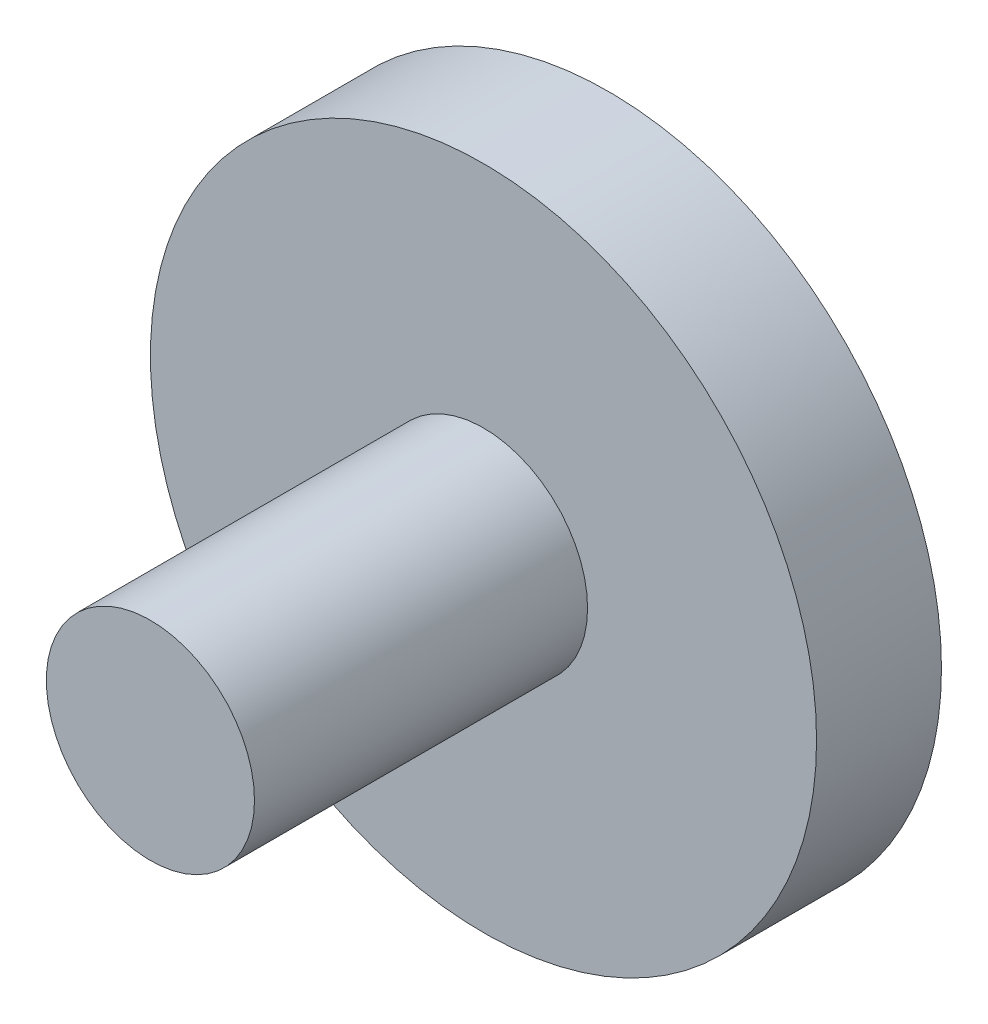
ISO-10303-21;
HEADER;
FILE_DESCRIPTION(('STEP AP214'),'2;1');
FILE_NAME('part.step','',(''),(''),'','','');
FILE_SCHEMA(('AUTOMOTIVE_DESIGN { 1 0 10303 214 1 1 1 1 }'));
ENDSEC;
DATA;
#1=APPLICATION_CONTEXT('core data for automotive mechanical design processes');
#2=APPLICATION_PROTOCOL_DEFINITION('international standard','automotive_design',2000,#1);
#3=PRODUCT_CONTEXT('',#1,'mechanical');
#4=PRODUCT('Part','Part','',(#3));
#5=PRODUCT_RELATED_PRODUCT_CATEGORY('part','',(#4));
#6=PRODUCT_DEFINITION_FORMATION('','',#4);
#7=PRODUCT_DEFINITION_CONTEXT('part definition',#1,'design');
#8=PRODUCT_DEFINITION('design','',#6,#7);
#9=PRODUCT_DEFINITION_SHAPE('','',#8);
#10=(LENGTH_UNIT() NAMED_UNIT(*) SI_UNIT(.MILLI.,.METRE.));
#11=(NAMED_UNIT(*) PLANE_ANGLE_UNIT() SI_UNIT($,.RADIAN.));
#12=(NAMED_UNIT(*) SI_UNIT($,.STERADIAN.) SOLID_ANGLE_UNIT());
#13=UNCERTAINTY_MEASURE_WITH_UNIT(LENGTH_MEASURE(1.E-05),#10,'distance_accuracy_value','');
#14=(GEOMETRIC_REPRESENTATION_CONTEXT(3) GLOBAL_UNCERTAINTY_ASSIGNED_CONTEXT((#13)) GLOBAL_UNIT_ASSIGNED_CONTEXT((#10,
#11,#12)) REPRESENTATION_CONTEXT('',''));
#15=CARTESIAN_POINT('',(0.,0.,0.));
#16=DIRECTION('',(0.,0.,1.));
#17=DIRECTION('',(1.,0.,0.));
#18=AXIS2_PLACEMENT_3D('',#15,#16,#17);
#19=CARTESIAN_POINT('',(0.,0.,-3.));
#20=DIRECTION('',(0.,0.,1.));
#21=DIRECTION('',(1.,0.,0.));
#22=AXIS2_PLACEMENT_3D('',#19,#20,#21);
#23=PLANE('',#22);
#24=CARTESIAN_POINT('',(0.,0.,-3.));
#25=DIRECTION('',(0.,0.,1.));
#26=DIRECTION('',(1.,0.,0.));
#27=AXIS2_PLACEMENT_3D('',#24,#25,#26);
#28=CIRCLE('',#27,8.);
#29=CARTESIAN_POINT('',(8.,0.,-3.));
#30=VERTEX_POINT('',#29);
#31=EDGE_CURVE('E112',#30,#30,#28,.T.);
#32=ORIENTED_EDGE('',*,*,#31,.F.);
#33=EDGE_LOOP('',(#32));
#34=FACE_BOUND('',#33,.T.);
#35=DIRECTION('',(-0.5,-0.866025403784439,0.));
#36=VECTOR('',#35,1.);
#37=CARTESIAN_POINT('',(1.29903810567666,-0.75,-3.));
#38=LINE('',#37,#36);
#39=CARTESIAN_POINT('',(1.73205080756888,0.,-3.));
#40=VERTEX_POINT('',#39);
#41=CARTESIAN_POINT('',(0.866025403784439,-1.5,-3.));
#42=VERTEX_POINT('',#41);
#43=EDGE_CURVE('E11',#40,#42,#38,.T.);
#44=ORIENTED_EDGE('',*,*,#43,.F.);
#45=DIRECTION('',(0.5,-0.866025403784439,0.));
#46=VECTOR('',#45,1.);
#47=CARTESIAN_POINT('',(1.29903810567666,0.75,-3.));
#48=LINE('',#47,#46);
#49=CARTESIAN_POINT('',(0.866025403784439,1.5,-3.));
#50=VERTEX_POINT('',#49);
#51=EDGE_CURVE('E50',#50,#40,#48,.T.);
#52=ORIENTED_EDGE('',*,*,#51,.F.);
#53=DIRECTION('',(1.,0.,0.));
#54=VECTOR('',#53,1.);
#55=CARTESIAN_POINT('',(0.,1.5,-3.));
#56=LINE('',#55,#54);
#57=CARTESIAN_POINT('',(-0.866025403784438,1.5,-3.));
#58=VERTEX_POINT('',#57);
#59=EDGE_CURVE('E133',#58,#50,#56,.T.);
#60=ORIENTED_EDGE('',*,*,#59,.F.);
#61=DIRECTION('',(0.5,0.866025403784439,0.));
#62=VECTOR('',#61,1.);
#63=CARTESIAN_POINT('',(-1.29903810567666,0.75,-3.));
#64=LINE('',#63,#62);
#65=CARTESIAN_POINT('',(-1.73205080756888,0.,-3.));
#66=VERTEX_POINT('',#65);
#67=EDGE_CURVE('E129',#66,#58,#64,.T.);
#68=ORIENTED_EDGE('',*,*,#67,.F.);
#69=DIRECTION('',(-0.5,0.866025403784439,0.));
#70=VECTOR('',#69,1.);
#71=CARTESIAN_POINT('',(-1.29903810567666,-0.75,-3.));
#72=LINE('',#71,#70);
#73=CARTESIAN_POINT('',(-0.866025403784439,-1.5,-3.));
#74=VERTEX_POINT('',#73);
#75=EDGE_CURVE('E130',#74,#66,#72,.T.);
#76=ORIENTED_EDGE('',*,*,#75,.F.);
#77=DIRECTION('',(-1.,0.,0.));
#78=VECTOR('',#77,1.);
#79=CARTESIAN_POINT('',(0.,-1.5,-3.));
#80=LINE('',#79,#78);
#81=EDGE_CURVE('E116',#42,#74,#80,.T.);
#82=ORIENTED_EDGE('',*,*,#81,.F.);
#83=EDGE_LOOP('',(#44,#52,#60,#68,#76,#82));
#84=FACE_BOUND('',#83,.T.);
#85=ADVANCED_FACE('F39',(#34,#84),#23,.F.);
#86=CARTESIAN_POINT('',(0.,0.,0.));
#87=DIRECTION('',(0.,0.,-1.));
#88=DIRECTION('',(-1.,0.,0.));
#89=AXIS2_PLACEMENT_3D('',#86,#87,#88);
#90=CYLINDRICAL_SURFACE('',#89,8.);
#91=CARTESIAN_POINT('',(0.,0.,0.));
#92=DIRECTION('',(0.,0.,1.));
#93=DIRECTION('',(1.,0.,0.));
#94=AXIS2_PLACEMENT_3D('',#91,#92,#93);
#95=CIRCLE('',#94,8.);
#96=CARTESIAN_POINT('',(8.,0.,0.));
#97=VERTEX_POINT('',#96);
#98=EDGE_CURVE('E121',#97,#97,#95,.T.);
#99=ORIENTED_EDGE('',*,*,#98,.F.);
#100=EDGE_LOOP('',(#99));
#101=FACE_BOUND('',#100,.T.);
#102=ORIENTED_EDGE('',*,*,#31,.T.);
#103=EDGE_LOOP('',(#102));
#104=FACE_BOUND('',#103,.T.);
#105=ADVANCED_FACE('F41',(#101,#104),#90,.T.);
#106=CARTESIAN_POINT('',(0.,0.,0.));
#107=DIRECTION('',(0.,0.,1.));
#108=DIRECTION('',(1.,0.,0.));
#109=AXIS2_PLACEMENT_3D('',#106,#107,#108);
#110=PLANE('',#109);
#111=CARTESIAN_POINT('',(0.,0.,0.));
#112=DIRECTION('',(0.,0.,1.));
#113=DIRECTION('',(1.,0.,0.));
#114=AXIS2_PLACEMENT_3D('',#111,#112,#113);
#115=CIRCLE('',#114,2.5);
#116=CARTESIAN_POINT('',(2.5,0.,0.));
#117=VERTEX_POINT('',#116);
#118=EDGE_CURVE('E119',#117,#117,#115,.T.);
#119=ORIENTED_EDGE('',*,*,#118,.F.);
#120=EDGE_LOOP('',(#119));
#121=FACE_BOUND('',#120,.T.);
#122=ORIENTED_EDGE('',*,*,#98,.T.);
#123=EDGE_LOOP('',(#122));
#124=FACE_BOUND('',#123,.T.);
#125=ADVANCED_FACE('F177',(#121,#124),#110,.T.);
#126=CARTESIAN_POINT('',(0.,0.,8.));
#127=DIRECTION('',(0.,0.,-1.));
#128=DIRECTION('',(-1.,0.,0.));
#129=AXIS2_PLACEMENT_3D('',#126,#127,#128);
#130=CYLINDRICAL_SURFACE('',#129,2.5);
#131=CARTESIAN_POINT('',(0.,0.,8.));
#132=DIRECTION('',(0.,0.,1.));
#133=DIRECTION('',(1.,0.,0.));
#134=AXIS2_PLACEMENT_3D('',#131,#132,#133);
#135=CIRCLE('',#134,2.5);
#136=CARTESIAN_POINT('',(2.5,0.,8.));
#137=VERTEX_POINT('',#136);
#138=EDGE_CURVE('E110',#137,#137,#135,.T.);
#139=ORIENTED_EDGE('',*,*,#138,.F.);
#140=EDGE_LOOP('',(#139));
#141=FACE_BOUND('',#140,.T.);
#142=ORIENTED_EDGE('',*,*,#118,.T.);
#143=EDGE_LOOP('',(#142));
#144=FACE_BOUND('',#143,.T.);
#145=ADVANCED_FACE('F184',(#141,#144),#130,.T.);
#146=CARTESIAN_POINT('',(0.,0.,8.));
#147=DIRECTION('',(0.,0.,1.));
#148=DIRECTION('',(1.,0.,0.));
#149=AXIS2_PLACEMENT_3D('',#146,#147,#148);
#150=PLANE('',#149);
#151=ORIENTED_EDGE('',*,*,#138,.T.);
#152=EDGE_LOOP('',(#151));
#153=FACE_BOUND('',#152,.T.);
#154=ADVANCED_FACE('F187',(#153),#150,.T.);
#155=CARTESIAN_POINT('',(0.866025403784439,-1.5,-1.4));
#156=DIRECTION('',(-0.866025403784439,0.5,0.));
#157=DIRECTION('',(-0.5,-0.866025403784439,0.));
#158=AXIS2_PLACEMENT_3D('',#155,#156,#157);
#159=PLANE('',#158);
#160=ORIENTED_EDGE('',*,*,#43,.T.);
#161=DIRECTION('',(0.,0.,-1.));
#162=VECTOR('',#161,1.);
#163=CARTESIAN_POINT('',(0.866025403784439,-1.5,-1.4));
#164=LINE('',#163,#162);
#165=CARTESIAN_POINT('',(0.866025403784439,-1.5,-1.4));
#166=VERTEX_POINT('',#165);
#167=EDGE_CURVE('E53',#166,#42,#164,.T.);
#168=ORIENTED_EDGE('',*,*,#167,.F.);
#169=DIRECTION('',(0.5,0.866025403784439,0.));
#170=VECTOR('',#169,1.);
#171=CARTESIAN_POINT('',(0.866025403784439,-1.5,-1.4));
#172=LINE('',#171,#170);
#173=CARTESIAN_POINT('',(1.73205080756888,0.,-1.4));
#174=VERTEX_POINT('',#173);
#175=EDGE_CURVE('E96',#166,#174,#172,.T.);
#176=ORIENTED_EDGE('',*,*,#175,.T.);
#177=DIRECTION('',(0.,0.,-1.));
#178=VECTOR('',#177,1.);
#179=CARTESIAN_POINT('',(1.73205080756888,0.,-1.4));
#180=LINE('',#179,#178);
#181=EDGE_CURVE('E103',#174,#40,#180,.T.);
#182=ORIENTED_EDGE('',*,*,#181,.T.);
#183=EDGE_LOOP('',(#160,#168,#176,#182));
#184=FACE_BOUND('',#183,.T.);
#185=ADVANCED_FACE('F105',(#184),#159,.T.);
#186=CARTESIAN_POINT('',(1.73205080756888,0.,-1.4));
#187=DIRECTION('',(-0.866025403784439,-0.5,0.));
#188=DIRECTION('',(0.5,-0.866025403784439,0.));
#189=AXIS2_PLACEMENT_3D('',#186,#187,#188);
#190=PLANE('',#189);
#191=ORIENTED_EDGE('',*,*,#51,.T.);
#192=ORIENTED_EDGE('',*,*,#181,.F.);
#193=DIRECTION('',(-0.5,0.866025403784439,0.));
#194=VECTOR('',#193,1.);
#195=CARTESIAN_POINT('',(1.73205080756888,0.,-1.4));
#196=LINE('',#195,#194);
#197=CARTESIAN_POINT('',(0.866025403784439,1.5,-1.4));
#198=VERTEX_POINT('',#197);
#199=EDGE_CURVE('E95',#174,#198,#196,.T.);
#200=ORIENTED_EDGE('',*,*,#199,.T.);
#201=DIRECTION('',(0.,0.,-1.));
#202=VECTOR('',#201,1.);
#203=CARTESIAN_POINT('',(0.866025403784439,1.5,-1.4));
#204=LINE('',#203,#202);
#205=EDGE_CURVE('E107',#198,#50,#204,.T.);
#206=ORIENTED_EDGE('',*,*,#205,.T.);
#207=EDGE_LOOP('',(#191,#192,#200,#206));
#208=FACE_BOUND('',#207,.T.);
#209=ADVANCED_FACE('F106',(#208),#190,.T.);
#210=CARTESIAN_POINT('',(0.866025403784439,1.5,-1.4));
#211=DIRECTION('',(0.,-1.,0.));
#212=DIRECTION('',(1.,0.,0.));
#213=AXIS2_PLACEMENT_3D('',#210,#211,#212);
#214=PLANE('',#213);
#215=ORIENTED_EDGE('',*,*,#59,.T.);
#216=ORIENTED_EDGE('',*,*,#205,.F.);
#217=DIRECTION('',(-1.,0.,0.));
#218=VECTOR('',#217,1.);
#219=CARTESIAN_POINT('',(0.866025403784439,1.5,-1.4));
#220=LINE('',#219,#218);
#221=CARTESIAN_POINT('',(-0.866025403784438,1.5,-1.4));
#222=VERTEX_POINT('',#221);
#223=EDGE_CURVE('E98',#198,#222,#220,.T.);
#224=ORIENTED_EDGE('',*,*,#223,.T.);
#225=DIRECTION('',(0.,0.,-1.));
#226=VECTOR('',#225,1.);
#227=CARTESIAN_POINT('',(-0.866025403784438,1.5,-1.4));
#228=LINE('',#227,#226);
#229=EDGE_CURVE('E114',#222,#58,#228,.T.);
#230=ORIENTED_EDGE('',*,*,#229,.T.);
#231=EDGE_LOOP('',(#215,#216,#224,#230));
#232=FACE_BOUND('',#231,.T.);
#233=ADVANCED_FACE('F131',(#232),#214,.T.);
#234=CARTESIAN_POINT('',(-0.866025403784438,1.5,-1.4));
#235=DIRECTION('',(0.866025403784439,-0.5,0.));
#236=DIRECTION('',(0.5,0.866025403784439,0.));
#237=AXIS2_PLACEMENT_3D('',#234,#235,#236);
#238=PLANE('',#237);
#239=ORIENTED_EDGE('',*,*,#67,.T.);
#240=ORIENTED_EDGE('',*,*,#229,.F.);
#241=DIRECTION('',(-0.5,-0.866025403784439,0.));
#242=VECTOR('',#241,1.);
#243=CARTESIAN_POINT('',(-0.866025403784438,1.5,-1.4));
#244=LINE('',#243,#242);
#245=CARTESIAN_POINT('',(-1.73205080756888,0.,-1.4));
#246=VERTEX_POINT('',#245);
#247=EDGE_CURVE('E157',#222,#246,#244,.T.);
#248=ORIENTED_EDGE('',*,*,#247,.T.);
#249=DIRECTION('',(0.,0.,-1.));
#250=VECTOR('',#249,1.);
#251=CARTESIAN_POINT('',(-1.73205080756888,0.,-1.4));
#252=LINE('',#251,#250);
#253=EDGE_CURVE('E151',#246,#66,#252,.T.);
#254=ORIENTED_EDGE('',*,*,#253,.T.);
#255=EDGE_LOOP('',(#239,#240,#248,#254));
#256=FACE_BOUND('',#255,.T.);
#257=ADVANCED_FACE('F165',(#256),#238,.T.);
#258=CARTESIAN_POINT('',(-1.73205080756888,0.,-1.4));
#259=DIRECTION('',(0.866025403784439,0.5,0.));
#260=DIRECTION('',(-0.5,0.866025403784439,0.));
#261=AXIS2_PLACEMENT_3D('',#258,#259,#260);
#262=PLANE('',#261);
#263=ORIENTED_EDGE('',*,*,#75,.T.);
#264=ORIENTED_EDGE('',*,*,#253,.F.);
#265=DIRECTION('',(0.5,-0.866025403784439,0.));
#266=VECTOR('',#265,1.);
#267=CARTESIAN_POINT('',(-1.73205080756888,0.,-1.4));
#268=LINE('',#267,#266);
#269=CARTESIAN_POINT('',(-0.866025403784439,-1.5,-1.4));
#270=VERTEX_POINT('',#269);
#271=EDGE_CURVE('E147',#246,#270,#268,.T.);
#272=ORIENTED_EDGE('',*,*,#271,.T.);
#273=DIRECTION('',(0.,0.,-1.));
#274=VECTOR('',#273,1.);
#275=CARTESIAN_POINT('',(-0.866025403784439,-1.5,-1.4));
#276=LINE('',#275,#274);
#277=EDGE_CURVE('E145',#270,#74,#276,.T.);
#278=ORIENTED_EDGE('',*,*,#277,.T.);
#279=EDGE_LOOP('',(#263,#264,#272,#278));
#280=FACE_BOUND('',#279,.T.);
#281=ADVANCED_FACE('F148',(#280),#262,.T.);
#282=CARTESIAN_POINT('',(-0.866025403784439,-1.5,-1.4));
#283=DIRECTION('',(0.,1.,0.));
#284=DIRECTION('',(-1.,0.,0.));
#285=AXIS2_PLACEMENT_3D('',#282,#283,#284);
#286=PLANE('',#285);
#287=ORIENTED_EDGE('',*,*,#81,.T.);
#288=ORIENTED_EDGE('',*,*,#277,.F.);
#289=DIRECTION('',(1.,0.,0.));
#290=VECTOR('',#289,1.);
#291=CARTESIAN_POINT('',(-0.866025403784439,-1.5,-1.4));
#292=LINE('',#291,#290);
#293=EDGE_CURVE('E152',#270,#166,#292,.T.);
#294=ORIENTED_EDGE('',*,*,#293,.T.);
#295=ORIENTED_EDGE('',*,*,#167,.T.);
#296=EDGE_LOOP('',(#287,#288,#294,#295));
#297=FACE_BOUND('',#296,.T.);
#298=ADVANCED_FACE('F141',(#297),#286,.T.);
#299=CARTESIAN_POINT('',(0.,0.,-1.4));
#300=DIRECTION('',(0.,0.,1.));
#301=DIRECTION('',(1.,0.,0.));
#302=AXIS2_PLACEMENT_3D('',#299,#300,#301);
#303=PLANE('',#302);
#304=ORIENTED_EDGE('',*,*,#175,.F.);
#305=ORIENTED_EDGE('',*,*,#293,.F.);
#306=ORIENTED_EDGE('',*,*,#271,.F.);
#307=ORIENTED_EDGE('',*,*,#247,.F.);
#308=ORIENTED_EDGE('',*,*,#223,.F.);
#309=ORIENTED_EDGE('',*,*,#199,.F.);
#310=EDGE_LOOP('',(#304,#305,#306,#307,#308,#309));
#311=FACE_BOUND('',#310,.T.);
#312=ADVANCED_FACE('F94',(#311),#303,.F.);
#313=CLOSED_SHELL('',(#85,#105,#125,#145,#154,#185,#209,#233,#257,#281,#298,#312));
#314=MANIFOLD_SOLID_BREP('B2',#313);
#315=ADVANCED_BREP_SHAPE_REPRESENTATION('',(#18,#314),#14);
#316=SHAPE_DEFINITION_REPRESENTATION(#9,#315);
ENDSEC;
END-ISO-10303-21;
